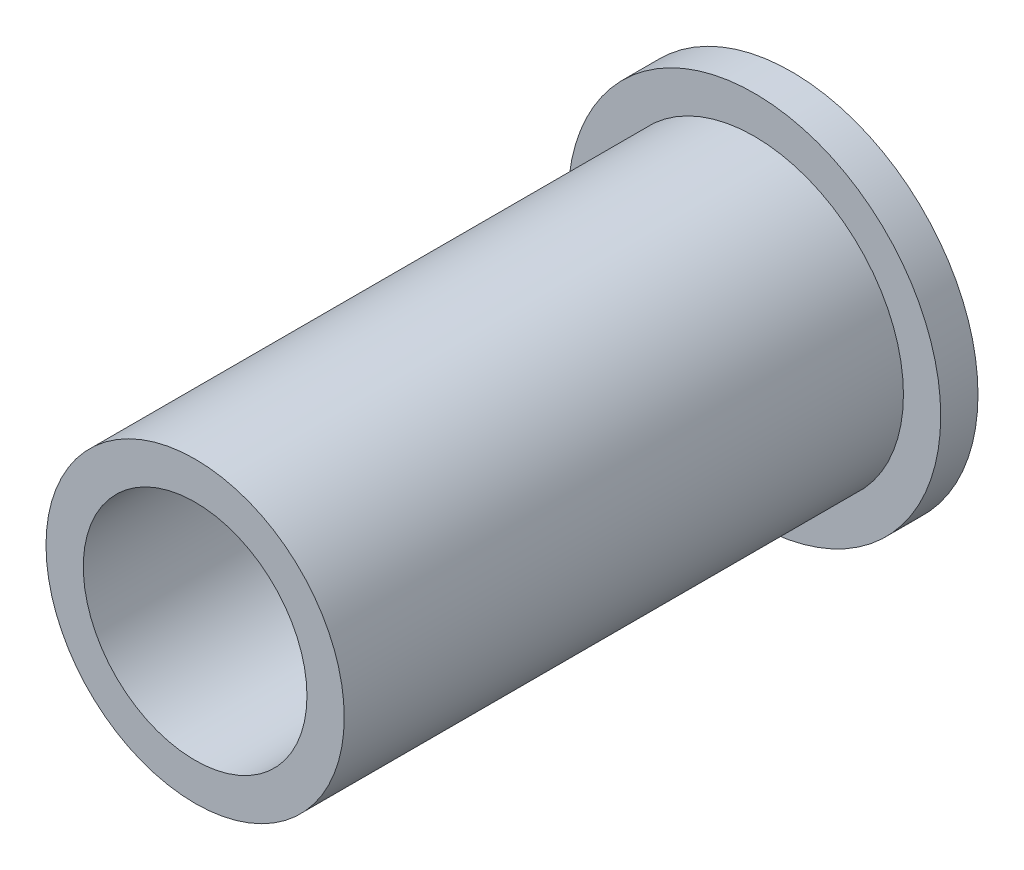
ISO-10303-21;
HEADER;
FILE_DESCRIPTION(('STEP AP214'),'2;1');
FILE_NAME('part.step','',(''),(''),'','','');
FILE_SCHEMA(('AUTOMOTIVE_DESIGN { 1 0 10303 214 1 1 1 1 }'));
ENDSEC;
DATA;
#1=APPLICATION_CONTEXT('core data for automotive mechanical design processes');
#2=APPLICATION_PROTOCOL_DEFINITION('international standard','automotive_design',2000,#1);
#3=PRODUCT_CONTEXT('',#1,'mechanical');
#4=PRODUCT('Part','Part','',(#3));
#5=PRODUCT_RELATED_PRODUCT_CATEGORY('part','',(#4));
#6=PRODUCT_DEFINITION_FORMATION('','',#4);
#7=PRODUCT_DEFINITION_CONTEXT('part definition',#1,'design');
#8=PRODUCT_DEFINITION('design','',#6,#7);
#9=PRODUCT_DEFINITION_SHAPE('','',#8);
#10=(LENGTH_UNIT() NAMED_UNIT(*) SI_UNIT(.MILLI.,.METRE.));
#11=(NAMED_UNIT(*) PLANE_ANGLE_UNIT() SI_UNIT($,.RADIAN.));
#12=(NAMED_UNIT(*) SI_UNIT($,.STERADIAN.) SOLID_ANGLE_UNIT());
#13=UNCERTAINTY_MEASURE_WITH_UNIT(LENGTH_MEASURE(1.E-05),#10,'distance_accuracy_value','');
#14=(GEOMETRIC_REPRESENTATION_CONTEXT(3) GLOBAL_UNCERTAINTY_ASSIGNED_CONTEXT((#13)) GLOBAL_UNIT_ASSIGNED_CONTEXT((#10,
#11,#12)) REPRESENTATION_CONTEXT('',''));
#15=CARTESIAN_POINT('',(0.,0.,0.));
#16=DIRECTION('',(0.,0.,1.));
#17=DIRECTION('',(1.,0.,0.));
#18=AXIS2_PLACEMENT_3D('',#15,#16,#17);
#19=CARTESIAN_POINT('',(0.,0.,5.));
#20=DIRECTION('',(0.,0.,-1.));
#21=DIRECTION('',(-1.,0.,0.));
#22=AXIS2_PLACEMENT_3D('',#19,#20,#21);
#23=CYLINDRICAL_SURFACE('',#22,25.);
#24=CARTESIAN_POINT('',(0.,0.,5.));
#25=DIRECTION('',(0.,0.,1.));
#26=DIRECTION('',(1.,0.,0.));
#27=AXIS2_PLACEMENT_3D('',#24,#25,#26);
#28=CIRCLE('',#27,25.);
#29=CARTESIAN_POINT('',(25.,0.,5.));
#30=VERTEX_POINT('',#29);
#31=EDGE_CURVE('E51',#30,#30,#28,.T.);
#32=ORIENTED_EDGE('',*,*,#31,.F.);
#33=EDGE_LOOP('',(#32));
#34=FACE_BOUND('',#33,.T.);
#35=CARTESIAN_POINT('',(0.,0.,0.));
#36=DIRECTION('',(0.,0.,1.));
#37=DIRECTION('',(1.,0.,0.));
#38=AXIS2_PLACEMENT_3D('',#35,#36,#37);
#39=CIRCLE('',#38,25.);
#40=CARTESIAN_POINT('',(25.,0.,0.));
#41=VERTEX_POINT('',#40);
#42=EDGE_CURVE('E46',#41,#41,#39,.T.);
#43=ORIENTED_EDGE('',*,*,#42,.T.);
#44=EDGE_LOOP('',(#43));
#45=FACE_BOUND('',#44,.T.);
#46=ADVANCED_FACE('F43',(#34,#45),#23,.T.);
#47=CARTESIAN_POINT('',(0.,0.,5.));
#48=DIRECTION('',(0.,0.,1.));
#49=DIRECTION('',(1.,0.,0.));
#50=AXIS2_PLACEMENT_3D('',#47,#48,#49);
#51=PLANE('',#50);
#52=CARTESIAN_POINT('',(0.,0.,5.));
#53=DIRECTION('',(0.,0.,1.));
#54=DIRECTION('',(1.,0.,0.));
#55=AXIS2_PLACEMENT_3D('',#52,#53,#54);
#56=CIRCLE('',#55,20.);
#57=CARTESIAN_POINT('',(20.,0.,5.));
#58=VERTEX_POINT('',#57);
#59=EDGE_CURVE('E10',#58,#58,#56,.T.);
#60=ORIENTED_EDGE('',*,*,#59,.F.);
#61=EDGE_LOOP('',(#60));
#62=FACE_BOUND('',#61,.T.);
#63=ORIENTED_EDGE('',*,*,#31,.T.);
#64=EDGE_LOOP('',(#63));
#65=FACE_BOUND('',#64,.T.);
#66=ADVANCED_FACE('F93',(#62,#65),#51,.T.);
#67=CARTESIAN_POINT('',(0.,0.,0.));
#68=DIRECTION('',(0.,0.,1.));
#69=DIRECTION('',(1.,0.,0.));
#70=AXIS2_PLACEMENT_3D('',#67,#68,#69);
#71=PLANE('',#70);
#72=ORIENTED_EDGE('',*,*,#42,.F.);
#73=EDGE_LOOP('',(#72));
#74=FACE_BOUND('',#73,.T.);
#75=ADVANCED_FACE('F87',(#74),#71,.F.);
#76=CARTESIAN_POINT('',(0.,0.,80.));
#77=DIRECTION('',(0.,0.,-1.));
#78=DIRECTION('',(-1.,0.,0.));
#79=AXIS2_PLACEMENT_3D('',#76,#77,#78);
#80=CYLINDRICAL_SURFACE('',#79,20.);
#81=CARTESIAN_POINT('',(0.,0.,80.));
#82=DIRECTION('',(0.,0.,1.));
#83=DIRECTION('',(1.,0.,0.));
#84=AXIS2_PLACEMENT_3D('',#81,#82,#83);
#85=CIRCLE('',#84,20.);
#86=CARTESIAN_POINT('',(20.,0.,80.));
#87=VERTEX_POINT('',#86);
#88=EDGE_CURVE('E58',#87,#87,#85,.T.);
#89=ORIENTED_EDGE('',*,*,#88,.F.);
#90=EDGE_LOOP('',(#89));
#91=FACE_BOUND('',#90,.T.);
#92=ORIENTED_EDGE('',*,*,#59,.T.);
#93=EDGE_LOOP('',(#92));
#94=FACE_BOUND('',#93,.T.);
#95=ADVANCED_FACE('F82',(#91,#94),#80,.T.);
#96=CARTESIAN_POINT('',(0.,0.,80.));
#97=DIRECTION('',(0.,0.,1.));
#98=DIRECTION('',(1.,0.,0.));
#99=AXIS2_PLACEMENT_3D('',#96,#97,#98);
#100=PLANE('',#99);
#101=CARTESIAN_POINT('',(0.,0.,80.));
#102=DIRECTION('',(0.,0.,1.));
#103=DIRECTION('',(1.,0.,0.));
#104=AXIS2_PLACEMENT_3D('',#101,#102,#103);
#105=CIRCLE('',#104,15.);
#106=CARTESIAN_POINT('',(15.,0.,80.));
#107=VERTEX_POINT('',#106);
#108=EDGE_CURVE('E63',#107,#107,#105,.T.);
#109=ORIENTED_EDGE('',*,*,#108,.F.);
#110=EDGE_LOOP('',(#109));
#111=FACE_BOUND('',#110,.T.);
#112=ORIENTED_EDGE('',*,*,#88,.T.);
#113=EDGE_LOOP('',(#112));
#114=FACE_BOUND('',#113,.T.);
#115=ADVANCED_FACE('F76',(#111,#114),#100,.T.);
#116=CARTESIAN_POINT('',(0.,0.,9.99999999999999));
#117=DIRECTION('',(0.,0.,1.));
#118=DIRECTION('',(1.,0.,0.));
#119=AXIS2_PLACEMENT_3D('',#116,#117,#118);
#120=CYLINDRICAL_SURFACE('',#119,15.);
#121=CARTESIAN_POINT('',(0.,0.,9.99999999999999));
#122=DIRECTION('',(0.,0.,1.));
#123=DIRECTION('',(1.,0.,0.));
#124=AXIS2_PLACEMENT_3D('',#121,#122,#123);
#125=CIRCLE('',#124,15.);
#126=CARTESIAN_POINT('',(15.,0.,9.99999999999999));
#127=VERTEX_POINT('',#126);
#128=EDGE_CURVE('E62',#127,#127,#125,.T.);
#129=ORIENTED_EDGE('',*,*,#128,.F.);
#130=EDGE_LOOP('',(#129));
#131=FACE_BOUND('',#130,.T.);
#132=ORIENTED_EDGE('',*,*,#108,.T.);
#133=EDGE_LOOP('',(#132));
#134=FACE_BOUND('',#133,.T.);
#135=ADVANCED_FACE('F73',(#131,#134),#120,.F.);
#136=CARTESIAN_POINT('',(0.,0.,9.99999999999999));
#137=DIRECTION('',(0.,0.,1.));
#138=DIRECTION('',(1.,0.,0.));
#139=AXIS2_PLACEMENT_3D('',#136,#137,#138);
#140=PLANE('',#139);
#141=ORIENTED_EDGE('',*,*,#128,.T.);
#142=EDGE_LOOP('',(#141));
#143=FACE_BOUND('',#142,.T.);
#144=ADVANCED_FACE('F71',(#143),#140,.T.);
#145=CLOSED_SHELL('',(#46,#66,#75,#95,#115,#135,#144));
#146=MANIFOLD_SOLID_BREP('B2',#145);
#147=ADVANCED_BREP_SHAPE_REPRESENTATION('',(#18,#146),#14);
#148=SHAPE_DEFINITION_REPRESENTATION(#9,#147);
ENDSEC;
END-ISO-10303-21;
